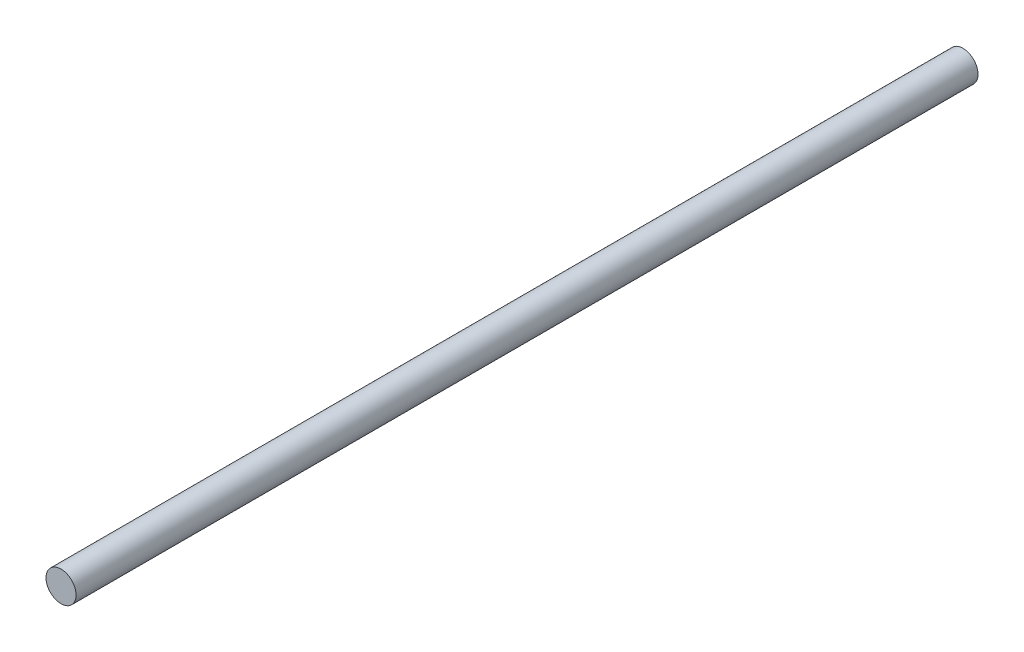
ISO-10303-21;
HEADER;
FILE_DESCRIPTION(('STEP AP214'),'2;1');
FILE_NAME('part.step','',(''),(''),'','','');
FILE_SCHEMA(('AUTOMOTIVE_DESIGN { 1 0 10303 214 1 1 1 1 }'));
ENDSEC;
DATA;
#1=APPLICATION_CONTEXT('core data for automotive mechanical design processes');
#2=APPLICATION_PROTOCOL_DEFINITION('international standard','automotive_design',2000,#1);
#3=PRODUCT_CONTEXT('',#1,'mechanical');
#4=PRODUCT('Part','Part','',(#3));
#5=PRODUCT_RELATED_PRODUCT_CATEGORY('part','',(#4));
#6=PRODUCT_DEFINITION_FORMATION('','',#4);
#7=PRODUCT_DEFINITION_CONTEXT('part definition',#1,'design');
#8=PRODUCT_DEFINITION('design','',#6,#7);
#9=PRODUCT_DEFINITION_SHAPE('','',#8);
#10=(LENGTH_UNIT() NAMED_UNIT(*) SI_UNIT(.MILLI.,.METRE.));
#11=(NAMED_UNIT(*) PLANE_ANGLE_UNIT() SI_UNIT($,.RADIAN.));
#12=(NAMED_UNIT(*) SI_UNIT($,.STERADIAN.) SOLID_ANGLE_UNIT());
#13=UNCERTAINTY_MEASURE_WITH_UNIT(LENGTH_MEASURE(1.E-05),#10,'distance_accuracy_value','');
#14=(GEOMETRIC_REPRESENTATION_CONTEXT(3) GLOBAL_UNCERTAINTY_ASSIGNED_CONTEXT((#13)) GLOBAL_UNIT_ASSIGNED_CONTEXT((#10,
#11,#12)) REPRESENTATION_CONTEXT('',''));
#15=CARTESIAN_POINT('',(0.,0.,0.));
#16=DIRECTION('',(0.,0.,1.));
#17=DIRECTION('',(1.,0.,0.));
#18=AXIS2_PLACEMENT_3D('',#15,#16,#17);
#19=CARTESIAN_POINT('',(0.,0.,180.));
#20=DIRECTION('',(0.,0.,-1.));
#21=DIRECTION('',(-1.,0.,0.));
#22=AXIS2_PLACEMENT_3D('',#19,#20,#21);
#23=CYLINDRICAL_SURFACE('',#22,3.);
#24=CARTESIAN_POINT('',(0.,0.,180.));
#25=DIRECTION('',(0.,0.,1.));
#26=DIRECTION('',(1.,0.,0.));
#27=AXIS2_PLACEMENT_3D('',#24,#25,#26);
#28=CIRCLE('',#27,3.);
#29=CARTESIAN_POINT('',(-3.,0.,180.));
#30=VERTEX_POINT('',#29);
#31=EDGE_CURVE('E10',#30,#30,#28,.T.);
#32=CARTESIAN_POINT('',(0.,0.,0.));
#33=DIRECTION('',(0.,0.,1.));
#34=DIRECTION('',(1.,0.,0.));
#35=AXIS2_PLACEMENT_3D('',#32,#33,#34);
#36=CIRCLE('',#35,3.);
#37=CARTESIAN_POINT('',(-3.,0.,0.));
#38=VERTEX_POINT('',#37);
#39=EDGE_CURVE('E46',#38,#38,#36,.T.);
#40=CARTESIAN_POINT('',(-3.,0.,180.));
#41=CARTESIAN_POINT('',(-3.,0.,178.125));
#42=CARTESIAN_POINT('',(-3.,0.,176.25));
#43=CARTESIAN_POINT('',(-3.,0.,172.5));
#44=CARTESIAN_POINT('',(-3.,0.,170.625));
#45=CARTESIAN_POINT('',(-3.,0.,166.875));
#46=CARTESIAN_POINT('',(-3.,0.,165.));
#47=CARTESIAN_POINT('',(-3.,0.,161.25));
#48=CARTESIAN_POINT('',(-3.,0.,159.375));
#49=CARTESIAN_POINT('',(-3.,0.,155.625));
#50=CARTESIAN_POINT('',(-3.,0.,153.75));
#51=CARTESIAN_POINT('',(-3.,0.,150.));
#52=CARTESIAN_POINT('',(-3.,0.,148.125));
#53=CARTESIAN_POINT('',(-3.,0.,144.375));
#54=CARTESIAN_POINT('',(-3.,0.,142.5));
#55=CARTESIAN_POINT('',(-3.,0.,138.75));
#56=CARTESIAN_POINT('',(-3.,0.,136.875));
#57=CARTESIAN_POINT('',(-3.,0.,133.125));
#58=CARTESIAN_POINT('',(-3.,0.,131.25));
#59=CARTESIAN_POINT('',(-3.,0.,127.5));
#60=CARTESIAN_POINT('',(-3.,0.,125.625));
#61=CARTESIAN_POINT('',(-3.,0.,121.875));
#62=CARTESIAN_POINT('',(-3.,0.,120.));
#63=CARTESIAN_POINT('',(-3.,0.,116.25));
#64=CARTESIAN_POINT('',(-3.,0.,114.375));
#65=CARTESIAN_POINT('',(-3.,0.,110.625));
#66=CARTESIAN_POINT('',(-3.,0.,108.75));
#67=CARTESIAN_POINT('',(-3.,0.,105.));
#68=CARTESIAN_POINT('',(-3.,0.,103.125));
#69=CARTESIAN_POINT('',(-3.,0.,99.375));
#70=CARTESIAN_POINT('',(-3.,0.,97.5));
#71=CARTESIAN_POINT('',(-3.,0.,93.75));
#72=CARTESIAN_POINT('',(-3.,0.,91.875));
#73=CARTESIAN_POINT('',(-3.,0.,88.125));
#74=CARTESIAN_POINT('',(-3.,0.,86.25));
#75=CARTESIAN_POINT('',(-3.,0.,82.5));
#76=CARTESIAN_POINT('',(-3.,0.,80.625));
#77=CARTESIAN_POINT('',(-3.,0.,76.875));
#78=CARTESIAN_POINT('',(-3.,0.,75.));
#79=CARTESIAN_POINT('',(-3.,0.,71.25));
#80=CARTESIAN_POINT('',(-3.,0.,69.375));
#81=CARTESIAN_POINT('',(-3.,0.,65.625));
#82=CARTESIAN_POINT('',(-3.,0.,63.75));
#83=CARTESIAN_POINT('',(-3.,0.,60.));
#84=CARTESIAN_POINT('',(-3.,0.,58.125));
#85=CARTESIAN_POINT('',(-3.,0.,54.375));
#86=CARTESIAN_POINT('',(-3.,0.,52.5));
#87=CARTESIAN_POINT('',(-3.,0.,48.75));
#88=CARTESIAN_POINT('',(-3.,0.,46.875));
#89=CARTESIAN_POINT('',(-3.,0.,43.125));
#90=CARTESIAN_POINT('',(-3.,0.,41.25));
#91=CARTESIAN_POINT('',(-3.,0.,37.5));
#92=CARTESIAN_POINT('',(-3.,0.,35.625));
#93=CARTESIAN_POINT('',(-3.,0.,31.875));
#94=CARTESIAN_POINT('',(-3.,0.,30.));
#95=CARTESIAN_POINT('',(-3.,0.,26.25));
#96=CARTESIAN_POINT('',(-3.,0.,24.375));
#97=CARTESIAN_POINT('',(-3.,0.,20.625));
#98=CARTESIAN_POINT('',(-3.,0.,18.75));
#99=CARTESIAN_POINT('',(-3.,0.,15.));
#100=CARTESIAN_POINT('',(-3.,0.,13.125));
#101=CARTESIAN_POINT('',(-3.,0.,9.37499999999998));
#102=CARTESIAN_POINT('',(-3.,0.,7.49999999999997));
#103=CARTESIAN_POINT('',(-3.,0.,3.74999999999997));
#104=CARTESIAN_POINT('',(-3.,0.,1.87499999999997));
#105=CARTESIAN_POINT('',(-3.,0.,0.));
#106=B_SPLINE_CURVE_WITH_KNOTS('',3,(#40,#41,#42,#43,#44,#45,#46,#47,#48,#49,#50,#51,#52,#53,
#54,#55,#56,#57,#58,#59,#60,#61,#62,#63,#64,#65,#66,#67,#68,#69,#70,#71,#72,#73,#74,#75,#76,#77,
#78,#79,#80,#81,#82,#83,#84,#85,#86,#87,#88,#89,#90,#91,#92,#93,#94,#95,#96,#97,#98,#99,#100,
#101,#102,#103,#104,#105),.UNSPECIFIED.,.F.,.F.,(4,2,2,2,2,2,2,2,2,2,2,2,2,2,2,2,2,2,2,2,2,2,2,
2,2,2,2,2,2,2,2,2,4),(0.,5.62500000000002,11.25,16.875,22.5,28.125,33.75,39.375,45.,50.625,
56.25,61.875,67.5,73.125,78.75,84.375,90.,95.625,101.25,106.875,112.5,118.125,123.75,129.375,
135.,140.625,146.25,151.875,157.5,163.125,168.75,174.375,180.),.UNSPECIFIED.);
#107=EDGE_CURVE('BSEAM43',#30,#38,#106,.T.);
#108=ORIENTED_EDGE('',*,*,#31,.F.);
#109=ORIENTED_EDGE('',*,*,#39,.T.);
#110=ORIENTED_EDGE('',*,*,#107,.T.);
#111=ORIENTED_EDGE('',*,*,#107,.F.);
#112=EDGE_LOOP('',(#108,#110,#109,#111));
#113=FACE_BOUND('',#112,.T.);
#114=ADVANCED_FACE('F43',(#113),#23,.T.);
#115=CARTESIAN_POINT('',(0.,0.,180.));
#116=DIRECTION('',(0.,0.,1.));
#117=DIRECTION('',(1.,0.,0.));
#118=AXIS2_PLACEMENT_3D('',#115,#116,#117);
#119=PLANE('',#118);
#120=ORIENTED_EDGE('',*,*,#31,.T.);
#121=EDGE_LOOP('',(#120));
#122=FACE_BOUND('',#121,.T.);
#123=ADVANCED_FACE('F60',(#122),#119,.T.);
#124=CARTESIAN_POINT('',(0.,0.,0.));
#125=DIRECTION('',(0.,0.,1.));
#126=DIRECTION('',(1.,0.,0.));
#127=AXIS2_PLACEMENT_3D('',#124,#125,#126);
#128=PLANE('',#127);
#129=ORIENTED_EDGE('',*,*,#39,.F.);
#130=EDGE_LOOP('',(#129));
#131=FACE_BOUND('',#130,.T.);
#132=ADVANCED_FACE('F58',(#131),#128,.F.);
#133=CLOSED_SHELL('',(#114,#123,#132));
#134=MANIFOLD_SOLID_BREP('B2',#133);
#135=ADVANCED_BREP_SHAPE_REPRESENTATION('',(#18,#134),#14);
#136=SHAPE_DEFINITION_REPRESENTATION(#9,#135);
ENDSEC;
END-ISO-10303-21;
